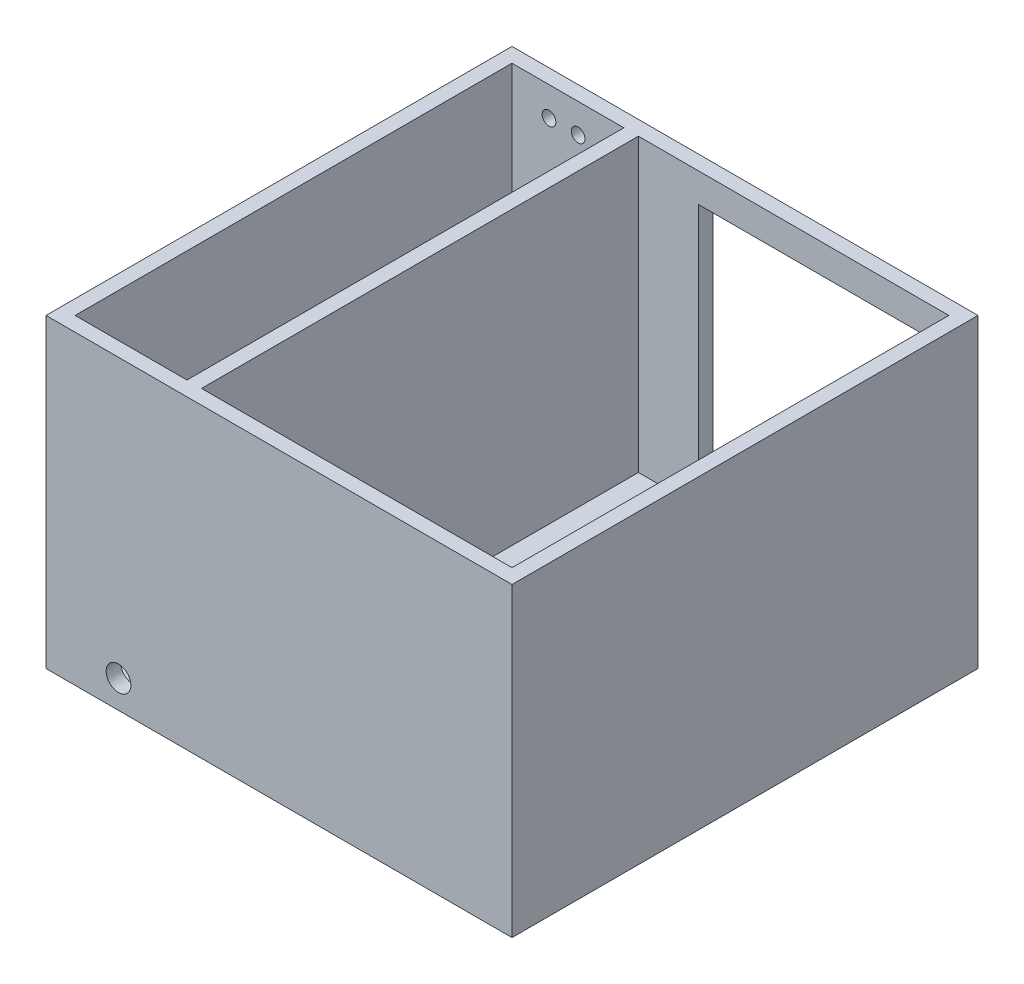
ISO-10303-21;
HEADER;
FILE_DESCRIPTION(('STEP AP214'),'2;1');
FILE_NAME('part.step','',(''),(''),'','','');
FILE_SCHEMA(('AUTOMOTIVE_DESIGN { 1 0 10303 214 1 1 1 1 }'));
ENDSEC;
DATA;
#1=APPLICATION_CONTEXT('core data for automotive mechanical design processes');
#2=APPLICATION_PROTOCOL_DEFINITION('international standard','automotive_design',2000,#1);
#3=PRODUCT_CONTEXT('',#1,'mechanical');
#4=PRODUCT('Part','Part','',(#3));
#5=PRODUCT_RELATED_PRODUCT_CATEGORY('part','',(#4));
#6=PRODUCT_DEFINITION_FORMATION('','',#4);
#7=PRODUCT_DEFINITION_CONTEXT('part definition',#1,'design');
#8=PRODUCT_DEFINITION('design','',#6,#7);
#9=PRODUCT_DEFINITION_SHAPE('','',#8);
#10=(LENGTH_UNIT() NAMED_UNIT(*) SI_UNIT(.MILLI.,.METRE.));
#11=(NAMED_UNIT(*) PLANE_ANGLE_UNIT() SI_UNIT($,.RADIAN.));
#12=(NAMED_UNIT(*) SI_UNIT($,.STERADIAN.) SOLID_ANGLE_UNIT());
#13=UNCERTAINTY_MEASURE_WITH_UNIT(LENGTH_MEASURE(1.E-05),#10,'distance_accuracy_value','');
#14=(GEOMETRIC_REPRESENTATION_CONTEXT(3) GLOBAL_UNCERTAINTY_ASSIGNED_CONTEXT((#13)) GLOBAL_UNIT_ASSIGNED_CONTEXT((#10,
#11,#12)) REPRESENTATION_CONTEXT('',''));
#15=CARTESIAN_POINT('',(0.,0.,0.));
#16=DIRECTION('',(0.,0.,1.));
#17=DIRECTION('',(1.,0.,0.));
#18=AXIS2_PLACEMENT_3D('',#15,#16,#17);
#19=CARTESIAN_POINT('',(0.,0.,6.35));
#20=DIRECTION('',(0.,0.,1.));
#21=DIRECTION('',(1.,0.,0.));
#22=AXIS2_PLACEMENT_3D('',#19,#20,#21);
#23=PLANE('',#22);
#24=CARTESIAN_POINT('',(-168.021,114.3,6.35));
#25=DIRECTION('',(0.,0.,1.));
#26=DIRECTION('',(1.,0.,0.));
#27=AXIS2_PLACEMENT_3D('',#24,#25,#26);
#28=CIRCLE('',#27,2.99720000000001);
#29=CARTESIAN_POINT('',(-165.0238,114.3,6.35));
#30=VERTEX_POINT('',#29);
#31=EDGE_CURVE('E501',#30,#30,#28,.F.);
#32=ORIENTED_EDGE('',*,*,#31,.T.);
#33=EDGE_LOOP('',(#32));
#34=FACE_BOUND('',#33,.T.);
#35=CARTESIAN_POINT('',(-180.721,114.3,6.35));
#36=DIRECTION('',(0.,0.,1.));
#37=DIRECTION('',(1.,0.,0.));
#38=AXIS2_PLACEMENT_3D('',#35,#36,#37);
#39=CIRCLE('',#38,2.99720000000001);
#40=CARTESIAN_POINT('',(-177.7238,114.3,6.35));
#41=VERTEX_POINT('',#40);
#42=EDGE_CURVE('E502',#41,#41,#39,.F.);
#43=ORIENTED_EDGE('',*,*,#42,.T.);
#44=EDGE_LOOP('',(#43));
#45=FACE_BOUND('',#44,.T.);
#46=DIRECTION('',(-1.,0.,0.));
#47=VECTOR('',#46,1.);
#48=CARTESIAN_POINT('',(0.,0.,6.35));
#49=LINE('',#48,#47);
#50=CARTESIAN_POINT('',(-148.082,0.,6.35));
#51=VERTEX_POINT('',#50);
#52=CARTESIAN_POINT('',(-196.85,0.,6.35));
#53=VERTEX_POINT('',#52);
#54=EDGE_CURVE('E352',#51,#53,#49,.T.);
#55=ORIENTED_EDGE('',*,*,#54,.F.);
#56=DIRECTION('',(0.,-1.,0.));
#57=VECTOR('',#56,1.);
#58=CARTESIAN_POINT('',(-148.082,317.605803951506,6.35));
#59=LINE('',#58,#57);
#60=CARTESIAN_POINT('',(-148.082,12.7,6.35));
#61=VERTEX_POINT('',#60);
#62=EDGE_CURVE('E478',#61,#51,#59,.T.);
#63=ORIENTED_EDGE('',*,*,#62,.F.);
#64=DIRECTION('',(1.,0.,0.));
#65=VECTOR('',#64,1.);
#66=CARTESIAN_POINT('',(-170.688,12.7,6.35));
#67=LINE('',#66,#65);
#68=CARTESIAN_POINT('',(-170.688,12.7,6.35));
#69=VERTEX_POINT('',#68);
#70=EDGE_CURVE('E327',#69,#61,#67,.T.);
#71=ORIENTED_EDGE('',*,*,#70,.F.);
#72=DIRECTION('',(0.,-1.,0.));
#73=VECTOR('',#72,1.);
#74=CARTESIAN_POINT('',(-170.688,16.002,6.35));
#75=LINE('',#74,#73);
#76=CARTESIAN_POINT('',(-170.688,16.002,6.35));
#77=VERTEX_POINT('',#76);
#78=EDGE_CURVE('E267',#77,#69,#75,.T.);
#79=ORIENTED_EDGE('',*,*,#78,.F.);
#80=DIRECTION('',(-1.,0.,0.));
#81=VECTOR('',#80,1.);
#82=CARTESIAN_POINT('',(-170.688,16.002,6.35));
#83=LINE('',#82,#81);
#84=CARTESIAN_POINT('',(-148.082,16.002,6.35));
#85=VERTEX_POINT('',#84);
#86=EDGE_CURVE('E331',#85,#77,#83,.T.);
#87=ORIENTED_EDGE('',*,*,#86,.F.);
#88=CARTESIAN_POINT('',(-148.082,127.,6.35));
#89=VERTEX_POINT('',#88);
#90=EDGE_CURVE('E55',#89,#85,#59,.T.);
#91=ORIENTED_EDGE('',*,*,#90,.F.);
#92=DIRECTION('',(-1.,0.,0.));
#93=VECTOR('',#92,1.);
#94=CARTESIAN_POINT('',(0.,127.,6.35));
#95=LINE('',#94,#93);
#96=CARTESIAN_POINT('',(-196.85,127.,6.35));
#97=VERTEX_POINT('',#96);
#98=EDGE_CURVE('E353',#89,#97,#95,.T.);
#99=ORIENTED_EDGE('',*,*,#98,.T.);
#100=DIRECTION('',(0.,1.,0.));
#101=VECTOR('',#100,1.);
#102=CARTESIAN_POINT('',(-196.85,0.,6.35));
#103=LINE('',#102,#101);
#104=EDGE_CURVE('E232',#53,#97,#103,.T.);
#105=ORIENTED_EDGE('',*,*,#104,.F.);
#106=EDGE_LOOP('',(#55,#63,#71,#79,#87,#91,#99,#105));
#107=FACE_BOUND('',#106,.T.);
#108=ADVANCED_FACE('F39',(#34,#45,#107),#23,.T.);
#109=CARTESIAN_POINT('',(0.,0.,0.));
#110=DIRECTION('',(0.,1.,0.));
#111=DIRECTION('',(0.,0.,1.));
#112=AXIS2_PLACEMENT_3D('',#109,#110,#111);
#113=PLANE('',#112);
#114=DIRECTION('',(1.,0.,0.));
#115=VECTOR('',#114,1.);
#116=CARTESIAN_POINT('',(-196.85,0.,196.85));
#117=LINE('',#116,#115);
#118=CARTESIAN_POINT('',(-196.85,0.,196.85));
#119=VERTEX_POINT('',#118);
#120=CARTESIAN_POINT('',(-148.082,0.,196.85));
#121=VERTEX_POINT('',#120);
#122=EDGE_CURVE('E219',#119,#121,#117,.T.);
#123=ORIENTED_EDGE('',*,*,#122,.T.);
#124=DIRECTION('',(0.,0.,1.));
#125=VECTOR('',#124,1.);
#126=CARTESIAN_POINT('',(-148.082,0.,6.35));
#127=LINE('',#126,#125);
#128=EDGE_CURVE('E487',#51,#121,#127,.T.);
#129=ORIENTED_EDGE('',*,*,#128,.F.);
#130=ORIENTED_EDGE('',*,*,#54,.T.);
#131=DIRECTION('',(0.,0.,1.));
#132=VECTOR('',#131,1.);
#133=CARTESIAN_POINT('',(-196.85,0.,6.35));
#134=LINE('',#133,#132);
#135=EDGE_CURVE('E239',#53,#119,#134,.T.);
#136=ORIENTED_EDGE('',*,*,#135,.T.);
#137=EDGE_LOOP('',(#123,#129,#130,#136));
#138=FACE_BOUND('',#137,.T.);
#139=ADVANCED_FACE('F392',(#138),#113,.T.);
#140=CARTESIAN_POINT('',(0.,0.,196.85));
#141=DIRECTION('',(0.,0.,-1.));
#142=DIRECTION('',(-1.,0.,0.));
#143=AXIS2_PLACEMENT_3D('',#140,#141,#142);
#144=PLANE('',#143);
#145=CARTESIAN_POINT('',(-171.577,5.7785,196.85));
#146=DIRECTION('',(0.,0.,-1.));
#147=DIRECTION('',(-1.,0.,0.));
#148=AXIS2_PLACEMENT_3D('',#145,#146,#147);
#149=CIRCLE('',#148,5.3975);
#150=CARTESIAN_POINT('',(-176.9745,5.7785,196.85));
#151=VERTEX_POINT('',#150);
#152=EDGE_CURVE('E492',#151,#151,#149,.F.);
#153=ORIENTED_EDGE('',*,*,#152,.T.);
#154=EDGE_LOOP('',(#153));
#155=FACE_BOUND('',#154,.T.);
#156=DIRECTION('',(1.,0.,0.));
#157=VECTOR('',#156,1.);
#158=CARTESIAN_POINT('',(-196.85,127.,196.85));
#159=LINE('',#158,#157);
#160=CARTESIAN_POINT('',(-196.85,127.,196.85));
#161=VERTEX_POINT('',#160);
#162=CARTESIAN_POINT('',(-148.082,127.,196.85));
#163=VERTEX_POINT('',#162);
#164=EDGE_CURVE('E189',#161,#163,#159,.T.);
#165=ORIENTED_EDGE('',*,*,#164,.T.);
#166=DIRECTION('',(0.,-1.,0.));
#167=VECTOR('',#166,1.);
#168=CARTESIAN_POINT('',(-148.082,317.605803951506,196.85));
#169=LINE('',#168,#167);
#170=EDGE_CURVE('E200',#163,#121,#169,.T.);
#171=ORIENTED_EDGE('',*,*,#170,.T.);
#172=ORIENTED_EDGE('',*,*,#122,.F.);
#173=DIRECTION('',(0.,1.,0.));
#174=VECTOR('',#173,1.);
#175=CARTESIAN_POINT('',(-196.85,0.,196.85));
#176=LINE('',#175,#174);
#177=EDGE_CURVE('E190',#119,#161,#176,.T.);
#178=ORIENTED_EDGE('',*,*,#177,.T.);
#179=EDGE_LOOP('',(#165,#171,#172,#178));
#180=FACE_BOUND('',#179,.T.);
#181=ADVANCED_FACE('F386',(#155,#180),#144,.T.);
#182=CARTESIAN_POINT('',(0.,0.,6.35));
#183=DIRECTION('',(-1.,0.,0.));
#184=DIRECTION('',(0.,0.,1.));
#185=AXIS2_PLACEMENT_3D('',#182,#183,#184);
#186=PLANE('',#185);
#187=DIRECTION('',(0.,0.,-1.));
#188=VECTOR('',#187,1.);
#189=CARTESIAN_POINT('',(0.,127.,6.35));
#190=LINE('',#189,#188);
#191=CARTESIAN_POINT('',(0.,127.,203.2));
#192=VERTEX_POINT('',#191);
#193=CARTESIAN_POINT('',(0.,127.,0.));
#194=VERTEX_POINT('',#193);
#195=EDGE_CURVE('E11',#192,#194,#190,.T.);
#196=ORIENTED_EDGE('',*,*,#195,.F.);
#197=DIRECTION('',(0.,1.,0.));
#198=VECTOR('',#197,1.);
#199=CARTESIAN_POINT('',(0.,-6.35,203.2));
#200=LINE('',#199,#198);
#201=CARTESIAN_POINT('',(0.,-6.35,203.2));
#202=VERTEX_POINT('',#201);
#203=EDGE_CURVE('E263',#202,#192,#200,.T.);
#204=ORIENTED_EDGE('',*,*,#203,.F.);
#205=DIRECTION('',(0.,0.,1.));
#206=VECTOR('',#205,1.);
#207=CARTESIAN_POINT('',(0.,-6.35,0.));
#208=LINE('',#207,#206);
#209=CARTESIAN_POINT('',(0.,-6.35,0.));
#210=VERTEX_POINT('',#209);
#211=EDGE_CURVE('E255',#210,#202,#208,.T.);
#212=ORIENTED_EDGE('',*,*,#211,.F.);
#213=DIRECTION('',(0.,1.,0.));
#214=VECTOR('',#213,1.);
#215=CARTESIAN_POINT('',(0.,0.,0.));
#216=LINE('',#215,#214);
#217=EDGE_CURVE('E313',#210,#194,#216,.T.);
#218=ORIENTED_EDGE('',*,*,#217,.T.);
#219=EDGE_LOOP('',(#196,#204,#212,#218));
#220=FACE_BOUND('',#219,.T.);
#221=ADVANCED_FACE('F41',(#220),#186,.F.);
#222=CARTESIAN_POINT('',(0.,127.,6.35));
#223=DIRECTION('',(0.,-1.,0.));
#224=DIRECTION('',(1.,0.,0.));
#225=AXIS2_PLACEMENT_3D('',#222,#223,#224);
#226=PLANE('',#225);
#227=ORIENTED_EDGE('',*,*,#98,.F.);
#228=DIRECTION('',(0.,0.,-1.));
#229=VECTOR('',#228,1.);
#230=CARTESIAN_POINT('',(-148.082,127.,6.35));
#231=LINE('',#230,#229);
#232=EDGE_CURVE('E205',#163,#89,#231,.T.);
#233=ORIENTED_EDGE('',*,*,#232,.F.);
#234=ORIENTED_EDGE('',*,*,#164,.F.);
#235=DIRECTION('',(0.,0.,1.));
#236=VECTOR('',#235,1.);
#237=CARTESIAN_POINT('',(-196.85,127.,6.35));
#238=LINE('',#237,#236);
#239=EDGE_CURVE('E236',#97,#161,#238,.T.);
#240=ORIENTED_EDGE('',*,*,#239,.F.);
#241=EDGE_LOOP('',(#227,#233,#234,#240));
#242=FACE_BOUND('',#241,.T.);
#243=DIRECTION('',(-1.,0.,0.));
#244=VECTOR('',#243,1.);
#245=CARTESIAN_POINT('',(-196.85,127.,203.2));
#246=LINE('',#245,#244);
#247=CARTESIAN_POINT('',(-203.2,127.,203.2));
#248=VERTEX_POINT('',#247);
#249=EDGE_CURVE('E243',#192,#248,#246,.T.);
#250=ORIENTED_EDGE('',*,*,#249,.F.);
#251=ORIENTED_EDGE('',*,*,#195,.T.);
#252=DIRECTION('',(-1.,0.,0.));
#253=VECTOR('',#252,1.);
#254=CARTESIAN_POINT('',(0.,127.,0.));
#255=LINE('',#254,#253);
#256=CARTESIAN_POINT('',(-203.2,127.,0.));
#257=VERTEX_POINT('',#256);
#258=EDGE_CURVE('E361',#194,#257,#255,.T.);
#259=ORIENTED_EDGE('',*,*,#258,.T.);
#260=DIRECTION('',(0.,0.,-1.));
#261=VECTOR('',#260,1.);
#262=CARTESIAN_POINT('',(-203.2,127.,6.35));
#263=LINE('',#262,#261);
#264=EDGE_CURVE('E48',#248,#257,#263,.T.);
#265=ORIENTED_EDGE('',*,*,#264,.F.);
#266=EDGE_LOOP('',(#250,#251,#259,#265));
#267=FACE_BOUND('',#266,.T.);
#268=DIRECTION('',(0.,0.,-1.));
#269=VECTOR('',#268,1.);
#270=CARTESIAN_POINT('',(-141.732,127.,6.35));
#271=LINE('',#270,#269);
#272=CARTESIAN_POINT('',(-141.732,127.,196.85));
#273=VERTEX_POINT('',#272);
#274=CARTESIAN_POINT('',(-141.732,127.,6.35));
#275=VERTEX_POINT('',#274);
#276=EDGE_CURVE('E182',#273,#275,#271,.T.);
#277=ORIENTED_EDGE('',*,*,#276,.T.);
#278=CARTESIAN_POINT('',(-6.35,127.,6.35));
#279=VERTEX_POINT('',#278);
#280=EDGE_CURVE('E63',#279,#275,#95,.T.);
#281=ORIENTED_EDGE('',*,*,#280,.F.);
#282=DIRECTION('',(0.,0.,1.));
#283=VECTOR('',#282,1.);
#284=CARTESIAN_POINT('',(-6.35,127.,6.35));
#285=LINE('',#284,#283);
#286=CARTESIAN_POINT('',(-6.35,127.,196.85));
#287=VERTEX_POINT('',#286);
#288=EDGE_CURVE('E184',#279,#287,#285,.T.);
#289=ORIENTED_EDGE('',*,*,#288,.T.);
#290=EDGE_CURVE('E178',#273,#287,#159,.T.);
#291=ORIENTED_EDGE('',*,*,#290,.F.);
#292=EDGE_LOOP('',(#277,#281,#289,#291));
#293=FACE_BOUND('',#292,.T.);
#294=ADVANCED_FACE('F180',(#242,#267,#293),#226,.F.);
#295=CARTESIAN_POINT('',(-203.2,0.,6.35));
#296=DIRECTION('',(-1.,0.,0.));
#297=DIRECTION('',(0.,0.,1.));
#298=AXIS2_PLACEMENT_3D('',#295,#296,#297);
#299=PLANE('',#298);
#300=DIRECTION('',(0.,1.,0.));
#301=VECTOR('',#300,1.);
#302=CARTESIAN_POINT('',(-203.2,-6.35,203.2));
#303=LINE('',#302,#301);
#304=CARTESIAN_POINT('',(-203.2,-6.35,203.2));
#305=VERTEX_POINT('',#304);
#306=EDGE_CURVE('E262',#305,#248,#303,.T.);
#307=ORIENTED_EDGE('',*,*,#306,.T.);
#308=ORIENTED_EDGE('',*,*,#264,.T.);
#309=DIRECTION('',(0.,1.,0.));
#310=VECTOR('',#309,1.);
#311=CARTESIAN_POINT('',(-203.2,0.,0.));
#312=LINE('',#311,#310);
#313=CARTESIAN_POINT('',(-203.2,-6.35,0.));
#314=VERTEX_POINT('',#313);
#315=EDGE_CURVE('E365',#314,#257,#312,.T.);
#316=ORIENTED_EDGE('',*,*,#315,.F.);
#317=DIRECTION('',(0.,0.,1.));
#318=VECTOR('',#317,1.);
#319=CARTESIAN_POINT('',(-203.2,-6.35,0.));
#320=LINE('',#319,#318);
#321=EDGE_CURVE('E247',#314,#305,#320,.T.);
#322=ORIENTED_EDGE('',*,*,#321,.T.);
#323=EDGE_LOOP('',(#307,#308,#316,#322));
#324=FACE_BOUND('',#323,.T.);
#325=ADVANCED_FACE('F370',(#324),#299,.T.);
#326=DIRECTION('',(0.,-1.,0.));
#327=VECTOR('',#326,1.);
#328=CARTESIAN_POINT('',(-141.732,317.605803951506,6.35));
#329=LINE('',#328,#327);
#330=CARTESIAN_POINT('',(-141.732,0.,6.35));
#331=VERTEX_POINT('',#330);
#332=EDGE_CURVE('E201',#275,#331,#329,.T.);
#333=ORIENTED_EDGE('',*,*,#332,.T.);
#334=CARTESIAN_POINT('',(-6.35,0.,6.35));
#335=VERTEX_POINT('',#334);
#336=EDGE_CURVE('E354',#335,#331,#49,.T.);
#337=ORIENTED_EDGE('',*,*,#336,.F.);
#338=DIRECTION('',(0.,1.,0.));
#339=VECTOR('',#338,1.);
#340=CARTESIAN_POINT('',(-6.35,0.,6.35));
#341=LINE('',#340,#339);
#342=EDGE_CURVE('E223',#335,#279,#341,.T.);
#343=ORIENTED_EDGE('',*,*,#342,.T.);
#344=ORIENTED_EDGE('',*,*,#280,.T.);
#345=EDGE_LOOP('',(#333,#337,#343,#344));
#346=FACE_BOUND('',#345,.T.);
#347=DIRECTION('',(0.,-1.,0.));
#348=VECTOR('',#347,1.);
#349=CARTESIAN_POINT('',(-115.57,114.3,6.35));
#350=LINE('',#349,#348);
#351=CARTESIAN_POINT('',(-115.57,114.3,6.35));
#352=VERTEX_POINT('',#351);
#353=CARTESIAN_POINT('',(-115.57,12.7,6.35));
#354=VERTEX_POINT('',#353);
#355=EDGE_CURVE('E283',#352,#354,#350,.T.);
#356=ORIENTED_EDGE('',*,*,#355,.F.);
#357=DIRECTION('',(-1.,0.,0.));
#358=VECTOR('',#357,1.);
#359=CARTESIAN_POINT('',(-115.57,114.3,6.35));
#360=LINE('',#359,#358);
#361=CARTESIAN_POINT('',(-13.97,114.3,6.35));
#362=VERTEX_POINT('',#361);
#363=EDGE_CURVE('E295',#362,#352,#360,.T.);
#364=ORIENTED_EDGE('',*,*,#363,.F.);
#365=DIRECTION('',(0.,1.,0.));
#366=VECTOR('',#365,1.);
#367=CARTESIAN_POINT('',(-13.97,114.3,6.35));
#368=LINE('',#367,#366);
#369=CARTESIAN_POINT('',(-13.97,12.7,6.35));
#370=VERTEX_POINT('',#369);
#371=EDGE_CURVE('E291',#370,#362,#368,.T.);
#372=ORIENTED_EDGE('',*,*,#371,.F.);
#373=DIRECTION('',(1.,0.,0.));
#374=VECTOR('',#373,1.);
#375=CARTESIAN_POINT('',(-115.57,12.7,6.35));
#376=LINE('',#375,#374);
#377=EDGE_CURVE('E286',#354,#370,#376,.T.);
#378=ORIENTED_EDGE('',*,*,#377,.F.);
#379=EDGE_LOOP('',(#356,#364,#372,#378));
#380=FACE_BOUND('',#379,.T.);
#381=ADVANCED_FACE('F398',(#346,#380),#23,.T.);
#382=CARTESIAN_POINT('',(0.,0.,0.));
#383=DIRECTION('',(0.,0.,1.));
#384=DIRECTION('',(1.,0.,0.));
#385=AXIS2_PLACEMENT_3D('',#382,#383,#384);
#386=PLANE('',#385);
#387=CARTESIAN_POINT('',(-168.021,114.3,0.));
#388=DIRECTION('',(0.,0.,-1.));
#389=DIRECTION('',(-1.,0.,0.));
#390=AXIS2_PLACEMENT_3D('',#387,#388,#389);
#391=CIRCLE('',#390,2.99720000000001);
#392=CARTESIAN_POINT('',(-171.0182,114.3,0.));
#393=VERTEX_POINT('',#392);
#394=EDGE_CURVE('E506',#393,#393,#391,.T.);
#395=ORIENTED_EDGE('',*,*,#394,.F.);
#396=EDGE_LOOP('',(#395));
#397=FACE_BOUND('',#396,.T.);
#398=CARTESIAN_POINT('',(-180.721,114.3,0.));
#399=DIRECTION('',(0.,0.,-1.));
#400=DIRECTION('',(-1.,0.,0.));
#401=AXIS2_PLACEMENT_3D('',#398,#399,#400);
#402=CIRCLE('',#401,2.99720000000001);
#403=CARTESIAN_POINT('',(-183.7182,114.3,0.));
#404=VERTEX_POINT('',#403);
#405=EDGE_CURVE('E507',#404,#404,#402,.T.);
#406=ORIENTED_EDGE('',*,*,#405,.F.);
#407=EDGE_LOOP('',(#406));
#408=FACE_BOUND('',#407,.T.);
#409=DIRECTION('',(1.,0.,0.));
#410=VECTOR('',#409,1.);
#411=CARTESIAN_POINT('',(-115.57,114.3,0.));
#412=LINE('',#411,#410);
#413=CARTESIAN_POINT('',(-115.57,114.3,0.));
#414=VERTEX_POINT('',#413);
#415=CARTESIAN_POINT('',(-13.97,114.3,0.));
#416=VERTEX_POINT('',#415);
#417=EDGE_CURVE('E275',#414,#416,#412,.T.);
#418=ORIENTED_EDGE('',*,*,#417,.F.);
#419=DIRECTION('',(0.,1.,0.));
#420=VECTOR('',#419,1.);
#421=CARTESIAN_POINT('',(-115.57,114.3,0.));
#422=LINE('',#421,#420);
#423=CARTESIAN_POINT('',(-115.57,12.7,0.));
#424=VERTEX_POINT('',#423);
#425=EDGE_CURVE('E279',#424,#414,#422,.T.);
#426=ORIENTED_EDGE('',*,*,#425,.F.);
#427=DIRECTION('',(-1.,0.,0.));
#428=VECTOR('',#427,1.);
#429=CARTESIAN_POINT('',(-115.57,12.7,0.));
#430=LINE('',#429,#428);
#431=CARTESIAN_POINT('',(-13.97,12.7,0.));
#432=VERTEX_POINT('',#431);
#433=EDGE_CURVE('E282',#432,#424,#430,.T.);
#434=ORIENTED_EDGE('',*,*,#433,.F.);
#435=DIRECTION('',(0.,-1.,0.));
#436=VECTOR('',#435,1.);
#437=CARTESIAN_POINT('',(-13.97,114.3,0.));
#438=LINE('',#437,#436);
#439=EDGE_CURVE('E271',#416,#432,#438,.T.);
#440=ORIENTED_EDGE('',*,*,#439,.F.);
#441=EDGE_LOOP('',(#418,#426,#434,#440));
#442=FACE_BOUND('',#441,.T.);
#443=DIRECTION('',(1.,0.,0.));
#444=VECTOR('',#443,1.);
#445=CARTESIAN_POINT('',(-170.688,16.002,0.));
#446=LINE('',#445,#444);
#447=CARTESIAN_POINT('',(-170.688,16.002,0.));
#448=VERTEX_POINT('',#447);
#449=CARTESIAN_POINT('',(-148.082,16.002,0.));
#450=VERTEX_POINT('',#449);
#451=EDGE_CURVE('E318',#448,#450,#446,.T.);
#452=ORIENTED_EDGE('',*,*,#451,.F.);
#453=DIRECTION('',(0.,1.,0.));
#454=VECTOR('',#453,1.);
#455=CARTESIAN_POINT('',(-170.688,16.002,0.));
#456=LINE('',#455,#454);
#457=CARTESIAN_POINT('',(-170.688,12.7,0.));
#458=VERTEX_POINT('',#457);
#459=EDGE_CURVE('E322',#458,#448,#456,.T.);
#460=ORIENTED_EDGE('',*,*,#459,.F.);
#461=DIRECTION('',(-1.,0.,0.));
#462=VECTOR('',#461,1.);
#463=CARTESIAN_POINT('',(-170.688,12.7,0.));
#464=LINE('',#463,#462);
#465=CARTESIAN_POINT('',(-148.082,12.7,0.));
#466=VERTEX_POINT('',#465);
#467=EDGE_CURVE('E287',#466,#458,#464,.T.);
#468=ORIENTED_EDGE('',*,*,#467,.F.);
#469=DIRECTION('',(0.,-1.,0.));
#470=VECTOR('',#469,1.);
#471=CARTESIAN_POINT('',(-148.082,16.002,0.));
#472=LINE('',#471,#470);
#473=EDGE_CURVE('E314',#450,#466,#472,.T.);
#474=ORIENTED_EDGE('',*,*,#473,.F.);
#475=EDGE_LOOP('',(#452,#460,#468,#474));
#476=FACE_BOUND('',#475,.T.);
#477=ORIENTED_EDGE('',*,*,#217,.F.);
#478=DIRECTION('',(1.,0.,0.));
#479=VECTOR('',#478,1.);
#480=CARTESIAN_POINT('',(-203.2,-6.35,0.));
#481=LINE('',#480,#479);
#482=EDGE_CURVE('E258',#314,#210,#481,.T.);
#483=ORIENTED_EDGE('',*,*,#482,.F.);
#484=ORIENTED_EDGE('',*,*,#315,.T.);
#485=ORIENTED_EDGE('',*,*,#258,.F.);
#486=EDGE_LOOP('',(#477,#483,#484,#485));
#487=FACE_BOUND('',#486,.T.);
#488=ADVANCED_FACE('F375',(#397,#408,#442,#476,#487),#386,.F.);
#489=CARTESIAN_POINT('',(-170.688,16.002,-143.684097937106));
#490=DIRECTION('',(-1.,0.,0.));
#491=DIRECTION('',(0.,0.,1.));
#492=AXIS2_PLACEMENT_3D('',#489,#490,#491);
#493=PLANE('',#492);
#494=ORIENTED_EDGE('',*,*,#459,.T.);
#495=DIRECTION('',(0.,0.,1.));
#496=VECTOR('',#495,1.);
#497=CARTESIAN_POINT('',(-170.688,16.002,-143.684097937106));
#498=LINE('',#497,#496);
#499=EDGE_CURVE('E319',#448,#77,#498,.T.);
#500=ORIENTED_EDGE('',*,*,#499,.T.);
#501=ORIENTED_EDGE('',*,*,#78,.T.);
#502=DIRECTION('',(0.,0.,1.));
#503=VECTOR('',#502,1.);
#504=CARTESIAN_POINT('',(-170.688,12.7,-143.684097937106));
#505=LINE('',#504,#503);
#506=EDGE_CURVE('E335',#458,#69,#505,.T.);
#507=ORIENTED_EDGE('',*,*,#506,.F.);
#508=EDGE_LOOP('',(#494,#500,#501,#507));
#509=FACE_BOUND('',#508,.T.);
#510=ADVANCED_FACE('F414',(#509),#493,.F.);
#511=CARTESIAN_POINT('',(-170.688,16.002,-143.684097937106));
#512=DIRECTION('',(0.,1.,0.));
#513=DIRECTION('',(0.,0.,1.));
#514=AXIS2_PLACEMENT_3D('',#511,#512,#513);
#515=PLANE('',#514);
#516=ORIENTED_EDGE('',*,*,#451,.T.);
#517=DIRECTION('',(0.,0.,1.));
#518=VECTOR('',#517,1.);
#519=CARTESIAN_POINT('',(-148.082,16.002,-143.684097937106));
#520=LINE('',#519,#518);
#521=EDGE_CURVE('E338',#450,#85,#520,.T.);
#522=ORIENTED_EDGE('',*,*,#521,.T.);
#523=ORIENTED_EDGE('',*,*,#86,.T.);
#524=ORIENTED_EDGE('',*,*,#499,.F.);
#525=EDGE_LOOP('',(#516,#522,#523,#524));
#526=FACE_BOUND('',#525,.T.);
#527=ADVANCED_FACE('F453',(#526),#515,.F.);
#528=CARTESIAN_POINT('',(-148.082,16.002,-143.684097937106));
#529=DIRECTION('',(1.,0.,0.));
#530=DIRECTION('',(0.,0.,-1.));
#531=AXIS2_PLACEMENT_3D('',#528,#529,#530);
#532=PLANE('',#531);
#533=ORIENTED_EDGE('',*,*,#473,.T.);
#534=DIRECTION('',(0.,0.,1.));
#535=VECTOR('',#534,1.);
#536=CARTESIAN_POINT('',(-148.082,12.7,-143.684097937106));
#537=LINE('',#536,#535);
#538=EDGE_CURVE('E341',#466,#61,#537,.T.);
#539=ORIENTED_EDGE('',*,*,#538,.T.);
#540=ORIENTED_EDGE('',*,*,#62,.T.);
#541=ORIENTED_EDGE('',*,*,#128,.T.);
#542=ORIENTED_EDGE('',*,*,#170,.F.);
#543=ORIENTED_EDGE('',*,*,#232,.T.);
#544=ORIENTED_EDGE('',*,*,#90,.T.);
#545=ORIENTED_EDGE('',*,*,#521,.F.);
#546=EDGE_LOOP('',(#533,#539,#540,#541,#542,#543,#544,#545));
#547=FACE_BOUND('',#546,.T.);
#548=ADVANCED_FACE('F456',(#547),#532,.F.);
#549=CARTESIAN_POINT('',(-170.688,12.7,-143.684097937106));
#550=DIRECTION('',(0.,-1.,0.));
#551=DIRECTION('',(0.,0.,-1.));
#552=AXIS2_PLACEMENT_3D('',#549,#550,#551);
#553=PLANE('',#552);
#554=ORIENTED_EDGE('',*,*,#467,.T.);
#555=ORIENTED_EDGE('',*,*,#506,.T.);
#556=ORIENTED_EDGE('',*,*,#70,.T.);
#557=ORIENTED_EDGE('',*,*,#538,.F.);
#558=EDGE_LOOP('',(#554,#555,#556,#557));
#559=FACE_BOUND('',#558,.T.);
#560=ADVANCED_FACE('F452',(#559),#553,.F.);
#561=CARTESIAN_POINT('',(-115.57,114.3,-143.684097937106));
#562=DIRECTION('',(-1.,0.,0.));
#563=DIRECTION('',(0.,0.,1.));
#564=AXIS2_PLACEMENT_3D('',#561,#562,#563);
#565=PLANE('',#564);
#566=ORIENTED_EDGE('',*,*,#425,.T.);
#567=DIRECTION('',(0.,0.,1.));
#568=VECTOR('',#567,1.);
#569=CARTESIAN_POINT('',(-115.57,114.3,-143.684097937106));
#570=LINE('',#569,#568);
#571=EDGE_CURVE('E276',#414,#352,#570,.T.);
#572=ORIENTED_EDGE('',*,*,#571,.T.);
#573=ORIENTED_EDGE('',*,*,#355,.T.);
#574=DIRECTION('',(0.,0.,1.));
#575=VECTOR('',#574,1.);
#576=CARTESIAN_POINT('',(-115.57,12.7,-143.684097937106));
#577=LINE('',#576,#575);
#578=EDGE_CURVE('E299',#424,#354,#577,.T.);
#579=ORIENTED_EDGE('',*,*,#578,.F.);
#580=EDGE_LOOP('',(#566,#572,#573,#579));
#581=FACE_BOUND('',#580,.T.);
#582=ADVANCED_FACE('F425',(#581),#565,.F.);
#583=CARTESIAN_POINT('',(-115.57,114.3,-143.684097937106));
#584=DIRECTION('',(0.,1.,0.));
#585=DIRECTION('',(0.,0.,1.));
#586=AXIS2_PLACEMENT_3D('',#583,#584,#585);
#587=PLANE('',#586);
#588=ORIENTED_EDGE('',*,*,#417,.T.);
#589=DIRECTION('',(0.,0.,1.));
#590=VECTOR('',#589,1.);
#591=CARTESIAN_POINT('',(-13.97,114.3,-143.684097937106));
#592=LINE('',#591,#590);
#593=EDGE_CURVE('E302',#416,#362,#592,.T.);
#594=ORIENTED_EDGE('',*,*,#593,.T.);
#595=ORIENTED_EDGE('',*,*,#363,.T.);
#596=ORIENTED_EDGE('',*,*,#571,.F.);
#597=EDGE_LOOP('',(#588,#594,#595,#596));
#598=FACE_BOUND('',#597,.T.);
#599=ADVANCED_FACE('F436',(#598),#587,.F.);
#600=CARTESIAN_POINT('',(-13.97,114.3,-143.684097937106));
#601=DIRECTION('',(1.,0.,0.));
#602=DIRECTION('',(0.,0.,-1.));
#603=AXIS2_PLACEMENT_3D('',#600,#601,#602);
#604=PLANE('',#603);
#605=ORIENTED_EDGE('',*,*,#439,.T.);
#606=DIRECTION('',(0.,0.,1.));
#607=VECTOR('',#606,1.);
#608=CARTESIAN_POINT('',(-13.97,12.7,-143.684097937106));
#609=LINE('',#608,#607);
#610=EDGE_CURVE('E305',#432,#370,#609,.T.);
#611=ORIENTED_EDGE('',*,*,#610,.T.);
#612=ORIENTED_EDGE('',*,*,#371,.T.);
#613=ORIENTED_EDGE('',*,*,#593,.F.);
#614=EDGE_LOOP('',(#605,#611,#612,#613));
#615=FACE_BOUND('',#614,.T.);
#616=ADVANCED_FACE('F439',(#615),#604,.F.);
#617=CARTESIAN_POINT('',(-115.57,12.7,-143.684097937106));
#618=DIRECTION('',(0.,-1.,0.));
#619=DIRECTION('',(1.,0.,0.));
#620=AXIS2_PLACEMENT_3D('',#617,#618,#619);
#621=PLANE('',#620);
#622=ORIENTED_EDGE('',*,*,#433,.T.);
#623=ORIENTED_EDGE('',*,*,#578,.T.);
#624=ORIENTED_EDGE('',*,*,#377,.T.);
#625=ORIENTED_EDGE('',*,*,#610,.F.);
#626=EDGE_LOOP('',(#622,#623,#624,#625));
#627=FACE_BOUND('',#626,.T.);
#628=ADVANCED_FACE('F429',(#627),#621,.F.);
#629=CARTESIAN_POINT('',(-203.2,-6.35,203.2));
#630=DIRECTION('',(0.,0.,1.));
#631=DIRECTION('',(1.,0.,0.));
#632=AXIS2_PLACEMENT_3D('',#629,#630,#631);
#633=PLANE('',#632);
#634=CARTESIAN_POINT('',(-171.577,5.7785,203.2));
#635=DIRECTION('',(0.,0.,1.));
#636=DIRECTION('',(1.,0.,0.));
#637=AXIS2_PLACEMENT_3D('',#634,#635,#636);
#638=CIRCLE('',#637,5.3975);
#639=CARTESIAN_POINT('',(-166.1795,5.7785,203.2));
#640=VERTEX_POINT('',#639);
#641=EDGE_CURVE('E497',#640,#640,#638,.T.);
#642=ORIENTED_EDGE('',*,*,#641,.F.);
#643=EDGE_LOOP('',(#642));
#644=FACE_BOUND('',#643,.T.);
#645=ORIENTED_EDGE('',*,*,#203,.T.);
#646=ORIENTED_EDGE('',*,*,#249,.T.);
#647=ORIENTED_EDGE('',*,*,#306,.F.);
#648=DIRECTION('',(1.,0.,0.));
#649=VECTOR('',#648,1.);
#650=CARTESIAN_POINT('',(-203.2,-6.35,203.2));
#651=LINE('',#650,#649);
#652=EDGE_CURVE('E251',#305,#202,#651,.T.);
#653=ORIENTED_EDGE('',*,*,#652,.T.);
#654=EDGE_LOOP('',(#645,#646,#647,#653));
#655=FACE_BOUND('',#654,.T.);
#656=ADVANCED_FACE('F383',(#644,#655),#633,.T.);
#657=CARTESIAN_POINT('',(0.,-6.35,0.));
#658=DIRECTION('',(0.,1.,0.));
#659=DIRECTION('',(0.,0.,1.));
#660=AXIS2_PLACEMENT_3D('',#657,#658,#659);
#661=PLANE('',#660);
#662=ORIENTED_EDGE('',*,*,#321,.F.);
#663=ORIENTED_EDGE('',*,*,#482,.T.);
#664=ORIENTED_EDGE('',*,*,#211,.T.);
#665=ORIENTED_EDGE('',*,*,#652,.F.);
#666=EDGE_LOOP('',(#662,#663,#664,#665));
#667=FACE_BOUND('',#666,.T.);
#668=ADVANCED_FACE('F380',(#667),#661,.F.);
#669=DIRECTION('',(0.,0.,1.));
#670=VECTOR('',#669,1.);
#671=CARTESIAN_POINT('',(-141.732,0.,6.35));
#672=LINE('',#671,#670);
#673=CARTESIAN_POINT('',(-141.732,0.,196.85));
#674=VERTEX_POINT('',#673);
#675=EDGE_CURVE('E490',#331,#674,#672,.T.);
#676=ORIENTED_EDGE('',*,*,#675,.T.);
#677=CARTESIAN_POINT('',(-6.35,0.,196.85));
#678=VERTEX_POINT('',#677);
#679=EDGE_CURVE('E196',#674,#678,#117,.T.);
#680=ORIENTED_EDGE('',*,*,#679,.T.);
#681=DIRECTION('',(0.,0.,1.));
#682=VECTOR('',#681,1.);
#683=CARTESIAN_POINT('',(-6.35,0.,6.35));
#684=LINE('',#683,#682);
#685=EDGE_CURVE('E226',#335,#678,#684,.T.);
#686=ORIENTED_EDGE('',*,*,#685,.F.);
#687=ORIENTED_EDGE('',*,*,#336,.T.);
#688=EDGE_LOOP('',(#676,#680,#686,#687));
#689=FACE_BOUND('',#688,.T.);
#690=ADVANCED_FACE('F404',(#689),#113,.T.);
#691=CARTESIAN_POINT('',(-196.85,0.,0.));
#692=DIRECTION('',(1.,0.,0.));
#693=DIRECTION('',(0.,0.,-1.));
#694=AXIS2_PLACEMENT_3D('',#691,#692,#693);
#695=PLANE('',#694);
#696=ORIENTED_EDGE('',*,*,#177,.F.);
#697=ORIENTED_EDGE('',*,*,#135,.F.);
#698=ORIENTED_EDGE('',*,*,#104,.T.);
#699=ORIENTED_EDGE('',*,*,#239,.T.);
#700=EDGE_LOOP('',(#696,#697,#698,#699));
#701=FACE_BOUND('',#700,.T.);
#702=ADVANCED_FACE('F542',(#701),#695,.T.);
#703=CARTESIAN_POINT('',(-6.35,0.,0.));
#704=DIRECTION('',(-1.,0.,0.));
#705=DIRECTION('',(0.,0.,-1.));
#706=AXIS2_PLACEMENT_3D('',#703,#704,#705);
#707=PLANE('',#706);
#708=DIRECTION('',(0.,1.,0.));
#709=VECTOR('',#708,1.);
#710=CARTESIAN_POINT('',(-6.35,0.,196.85));
#711=LINE('',#710,#709);
#712=EDGE_CURVE('E216',#678,#287,#711,.T.);
#713=ORIENTED_EDGE('',*,*,#712,.T.);
#714=ORIENTED_EDGE('',*,*,#288,.F.);
#715=ORIENTED_EDGE('',*,*,#342,.F.);
#716=ORIENTED_EDGE('',*,*,#685,.T.);
#717=EDGE_LOOP('',(#713,#714,#715,#716));
#718=FACE_BOUND('',#717,.T.);
#719=ADVANCED_FACE('F539',(#718),#707,.T.);
#720=DIRECTION('',(0.,-1.,0.));
#721=VECTOR('',#720,1.);
#722=CARTESIAN_POINT('',(-141.732,317.605803951506,196.85));
#723=LINE('',#722,#721);
#724=EDGE_CURVE('E194',#273,#674,#723,.T.);
#725=ORIENTED_EDGE('',*,*,#724,.F.);
#726=ORIENTED_EDGE('',*,*,#290,.T.);
#727=ORIENTED_EDGE('',*,*,#712,.F.);
#728=ORIENTED_EDGE('',*,*,#679,.F.);
#729=EDGE_LOOP('',(#725,#726,#727,#728));
#730=FACE_BOUND('',#729,.T.);
#731=ADVANCED_FACE('F195',(#730),#144,.T.);
#732=CARTESIAN_POINT('',(-141.732,317.605803951506,6.35));
#733=DIRECTION('',(1.,0.,0.));
#734=DIRECTION('',(0.,0.,-1.));
#735=AXIS2_PLACEMENT_3D('',#732,#733,#734);
#736=PLANE('',#735);
#737=ORIENTED_EDGE('',*,*,#276,.F.);
#738=ORIENTED_EDGE('',*,*,#724,.T.);
#739=ORIENTED_EDGE('',*,*,#675,.F.);
#740=ORIENTED_EDGE('',*,*,#332,.F.);
#741=EDGE_LOOP('',(#737,#738,#739,#740));
#742=FACE_BOUND('',#741,.T.);
#743=ADVANCED_FACE('F203',(#742),#736,.T.);
#744=CARTESIAN_POINT('',(-171.577,5.7785,181.583564594182));
#745=DIRECTION('',(0.,0.,1.));
#746=DIRECTION('',(1.,0.,0.));
#747=AXIS2_PLACEMENT_3D('',#744,#745,#746);
#748=CYLINDRICAL_SURFACE('',#747,5.3975);
#749=ORIENTED_EDGE('',*,*,#641,.T.);
#750=EDGE_LOOP('',(#749));
#751=FACE_BOUND('',#750,.T.);
#752=ORIENTED_EDGE('',*,*,#152,.F.);
#753=EDGE_LOOP('',(#752));
#754=FACE_BOUND('',#753,.T.);
#755=ADVANCED_FACE('F525',(#751,#754),#748,.F.);
#756=CARTESIAN_POINT('',(-180.721,114.3,14.8273617782893));
#757=DIRECTION('',(0.,0.,-1.));
#758=DIRECTION('',(-1.,0.,0.));
#759=AXIS2_PLACEMENT_3D('',#756,#757,#758);
#760=CYLINDRICAL_SURFACE('',#759,2.99720000000001);
#761=ORIENTED_EDGE('',*,*,#405,.T.);
#762=EDGE_LOOP('',(#761));
#763=FACE_BOUND('',#762,.T.);
#764=ORIENTED_EDGE('',*,*,#42,.F.);
#765=EDGE_LOOP('',(#764));
#766=FACE_BOUND('',#765,.T.);
#767=ADVANCED_FACE('F522',(#763,#766),#760,.F.);
#768=CARTESIAN_POINT('',(-168.021,114.3,14.8273617782893));
#769=DIRECTION('',(0.,0.,-1.));
#770=DIRECTION('',(-1.,0.,0.));
#771=AXIS2_PLACEMENT_3D('',#768,#769,#770);
#772=CYLINDRICAL_SURFACE('',#771,2.99720000000001);
#773=ORIENTED_EDGE('',*,*,#394,.T.);
#774=EDGE_LOOP('',(#773));
#775=FACE_BOUND('',#774,.T.);
#776=ORIENTED_EDGE('',*,*,#31,.F.);
#777=EDGE_LOOP('',(#776));
#778=FACE_BOUND('',#777,.T.);
#779=ADVANCED_FACE('F517',(#775,#778),#772,.F.);
#780=CLOSED_SHELL('',(#108,#139,#181,#221,#294,#325,#381,#488,#510,#527,#548,#560,#582,#599,
#616,#628,#656,#668,#690,#702,#719,#731,#743,#755,#767,#779));
#781=MANIFOLD_SOLID_BREP('B2',#780);
#782=ADVANCED_BREP_SHAPE_REPRESENTATION('',(#18,#781),#14);
#783=SHAPE_DEFINITION_REPRESENTATION(#9,#782);
ENDSEC;
END-ISO-10303-21;
